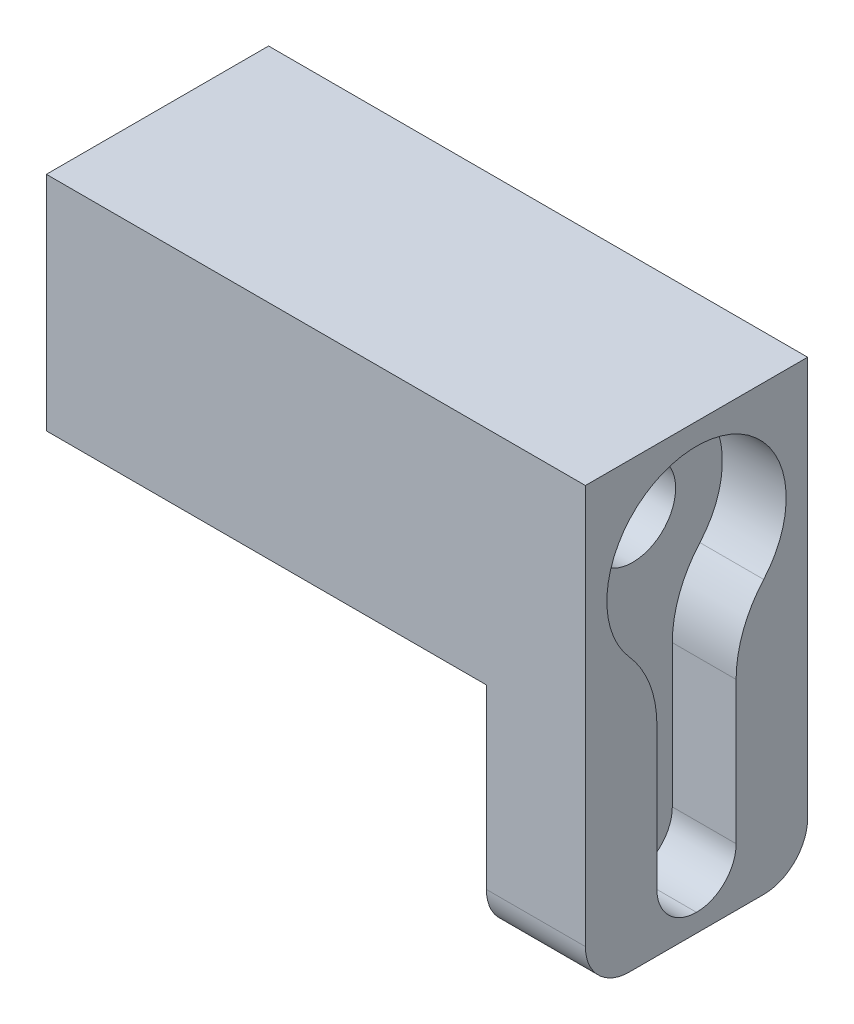
ISO-10303-21;
HEADER;
FILE_DESCRIPTION(('STEP AP214'),'2;1');
FILE_NAME('part.step','',(''),(''),'','','');
FILE_SCHEMA(('AUTOMOTIVE_DESIGN { 1 0 10303 214 1 1 1 1 }'));
ENDSEC;
DATA;
#1=APPLICATION_CONTEXT('core data for automotive mechanical design processes');
#2=APPLICATION_PROTOCOL_DEFINITION('international standard','automotive_design',2000,#1);
#3=PRODUCT_CONTEXT('',#1,'mechanical');
#4=PRODUCT('Part','Part','',(#3));
#5=PRODUCT_RELATED_PRODUCT_CATEGORY('part','',(#4));
#6=PRODUCT_DEFINITION_FORMATION('','',#4);
#7=PRODUCT_DEFINITION_CONTEXT('part definition',#1,'design');
#8=PRODUCT_DEFINITION('design','',#6,#7);
#9=PRODUCT_DEFINITION_SHAPE('','',#8);
#10=(LENGTH_UNIT() NAMED_UNIT(*) SI_UNIT(.MILLI.,.METRE.));
#11=(NAMED_UNIT(*) PLANE_ANGLE_UNIT() SI_UNIT($,.RADIAN.));
#12=(NAMED_UNIT(*) SI_UNIT($,.STERADIAN.) SOLID_ANGLE_UNIT());
#13=UNCERTAINTY_MEASURE_WITH_UNIT(LENGTH_MEASURE(1.E-05),#10,'distance_accuracy_value','');
#14=(GEOMETRIC_REPRESENTATION_CONTEXT(3) GLOBAL_UNCERTAINTY_ASSIGNED_CONTEXT((#13)) GLOBAL_UNIT_ASSIGNED_CONTEXT((#10,
#11,#12)) REPRESENTATION_CONTEXT('',''));
#15=CARTESIAN_POINT('',(0.,0.,0.));
#16=DIRECTION('',(0.,0.,1.));
#17=DIRECTION('',(1.,0.,0.));
#18=AXIS2_PLACEMENT_3D('',#15,#16,#17);
#19=CARTESIAN_POINT('',(29.,0.,0.));
#20=DIRECTION('',(-1.,0.,0.));
#21=DIRECTION('',(0.,0.,1.));
#22=AXIS2_PLACEMENT_3D('',#19,#20,#21);
#23=CYLINDRICAL_SURFACE('',#22,3.9);
#24=CARTESIAN_POINT('',(23.2,0.,0.));
#25=DIRECTION('',(1.,0.,0.));
#26=DIRECTION('',(0.,0.,-1.));
#27=AXIS2_PLACEMENT_3D('',#24,#25,#26);
#28=CIRCLE('',#27,3.9);
#29=CARTESIAN_POINT('',(23.2,0.,-3.9));
#30=VERTEX_POINT('',#29);
#31=EDGE_CURVE('E204',#30,#30,#28,.T.);
#32=ORIENTED_EDGE('',*,*,#31,.T.);
#33=EDGE_LOOP('',(#32));
#34=FACE_BOUND('',#33,.T.);
#35=CARTESIAN_POINT('',(19.,0.,0.));
#36=DIRECTION('',(-1.,0.,0.));
#37=DIRECTION('',(0.,0.,1.));
#38=AXIS2_PLACEMENT_3D('',#35,#36,#37);
#39=CIRCLE('',#38,3.9);
#40=CARTESIAN_POINT('',(19.,0.,3.9));
#41=VERTEX_POINT('',#40);
#42=EDGE_CURVE('E256',#41,#41,#39,.F.);
#43=ORIENTED_EDGE('',*,*,#42,.F.);
#44=EDGE_LOOP('',(#43));
#45=FACE_BOUND('',#44,.T.);
#46=ADVANCED_FACE('F36',(#34,#45),#23,.F.);
#47=CARTESIAN_POINT('',(20.,0.,0.));
#48=DIRECTION('',(1.,0.,0.));
#49=DIRECTION('',(0.,0.,-1.));
#50=AXIS2_PLACEMENT_3D('',#47,#48,#49);
#51=PLANE('',#50);
#52=CARTESIAN_POINT('',(20.,-20.6,0.));
#53=DIRECTION('',(1.,0.,0.));
#54=DIRECTION('',(0.,0.,-1.));
#55=AXIS2_PLACEMENT_3D('',#52,#53,#54);
#56=CIRCLE('',#55,1.75);
#57=CARTESIAN_POINT('',(20.,-20.6,-1.75));
#58=VERTEX_POINT('',#57);
#59=EDGE_CURVE('E201',#58,#58,#56,.F.);
#60=ORIENTED_EDGE('',*,*,#59,.F.);
#61=EDGE_LOOP('',(#60));
#62=FACE_BOUND('',#61,.T.);
#63=DIRECTION('',(0.,1.,0.));
#64=VECTOR('',#63,1.);
#65=CARTESIAN_POINT('',(20.,-30.2,-10.1));
#66=LINE('',#65,#64);
#67=CARTESIAN_POINT('',(20.,-26.2,-10.1));
#68=VERTEX_POINT('',#67);
#69=CARTESIAN_POINT('',(20.,-10.1,-10.1));
#70=VERTEX_POINT('',#69);
#71=EDGE_CURVE('E168',#68,#70,#66,.T.);
#72=ORIENTED_EDGE('',*,*,#71,.F.);
#73=CARTESIAN_POINT('',(20.,-26.2,-6.1));
#74=DIRECTION('',(1.,0.,0.));
#75=DIRECTION('',(0.,0.,-1.));
#76=AXIS2_PLACEMENT_3D('',#73,#74,#75);
#77=CIRCLE('',#76,4.);
#78=CARTESIAN_POINT('',(20.,-30.2,-6.09999999999999));
#79=VERTEX_POINT('',#78);
#80=EDGE_CURVE('E268',#68,#79,#77,.F.);
#81=ORIENTED_EDGE('',*,*,#80,.T.);
#82=DIRECTION('',(0.,0.,-1.));
#83=VECTOR('',#82,1.);
#84=CARTESIAN_POINT('',(20.,-30.2,22.5));
#85=LINE('',#84,#83);
#86=CARTESIAN_POINT('',(20.,-30.2,6.10000000000001));
#87=VERTEX_POINT('',#86);
#88=EDGE_CURVE('E195',#87,#79,#85,.T.);
#89=ORIENTED_EDGE('',*,*,#88,.F.);
#90=CARTESIAN_POINT('',(20.,-26.2,6.1));
#91=DIRECTION('',(1.,0.,0.));
#92=DIRECTION('',(0.,0.,-1.));
#93=AXIS2_PLACEMENT_3D('',#90,#91,#92);
#94=CIRCLE('',#93,4.);
#95=CARTESIAN_POINT('',(20.,-26.2,10.1));
#96=VERTEX_POINT('',#95);
#97=EDGE_CURVE('E266',#87,#96,#94,.F.);
#98=ORIENTED_EDGE('',*,*,#97,.T.);
#99=DIRECTION('',(0.,-1.,0.));
#100=VECTOR('',#99,1.);
#101=CARTESIAN_POINT('',(20.,10.1,10.1));
#102=LINE('',#101,#100);
#103=CARTESIAN_POINT('',(20.,-10.1,10.1));
#104=VERTEX_POINT('',#103);
#105=EDGE_CURVE('E163',#104,#96,#102,.T.);
#106=ORIENTED_EDGE('',*,*,#105,.F.);
#107=DIRECTION('',(0.,0.,1.));
#108=VECTOR('',#107,1.);
#109=CARTESIAN_POINT('',(20.,-10.1,-10.1));
#110=LINE('',#109,#108);
#111=EDGE_CURVE('E162',#70,#104,#110,.T.);
#112=ORIENTED_EDGE('',*,*,#111,.F.);
#113=EDGE_LOOP('',(#72,#81,#89,#98,#106,#112));
#114=FACE_BOUND('',#113,.T.);
#115=ADVANCED_FACE('F283',(#62,#114),#51,.F.);
#116=CARTESIAN_POINT('',(29.,0.,0.));
#117=DIRECTION('',(1.,0.,0.));
#118=DIRECTION('',(0.,0.,-1.));
#119=AXIS2_PLACEMENT_3D('',#116,#117,#118);
#120=PLANE('',#119);
#121=DIRECTION('',(0.,0.,1.));
#122=VECTOR('',#121,1.);
#123=CARTESIAN_POINT('',(29.,-30.2,22.5));
#124=LINE('',#123,#122);
#125=CARTESIAN_POINT('',(29.,-30.2,-6.09999999999999));
#126=VERTEX_POINT('',#125);
#127=CARTESIAN_POINT('',(29.,-30.2,6.10000000000001));
#128=VERTEX_POINT('',#127);
#129=EDGE_CURVE('E180',#126,#128,#124,.T.);
#130=ORIENTED_EDGE('',*,*,#129,.F.);
#131=CARTESIAN_POINT('',(29.,-26.2,-6.1));
#132=DIRECTION('',(1.,0.,0.));
#133=DIRECTION('',(0.,0.,-1.));
#134=AXIS2_PLACEMENT_3D('',#131,#132,#133);
#135=CIRCLE('',#134,4.);
#136=CARTESIAN_POINT('',(29.,-26.2,-10.1));
#137=VERTEX_POINT('',#136);
#138=EDGE_CURVE('E44',#126,#137,#135,.T.);
#139=ORIENTED_EDGE('',*,*,#138,.T.);
#140=DIRECTION('',(0.,-1.,0.));
#141=VECTOR('',#140,1.);
#142=CARTESIAN_POINT('',(29.,-30.2,-10.1));
#143=LINE('',#142,#141);
#144=CARTESIAN_POINT('',(29.,10.1,-10.1));
#145=VERTEX_POINT('',#144);
#146=EDGE_CURVE('E148',#145,#137,#143,.T.);
#147=ORIENTED_EDGE('',*,*,#146,.F.);
#148=DIRECTION('',(0.,0.,-1.));
#149=VECTOR('',#148,1.);
#150=CARTESIAN_POINT('',(29.,10.1,-10.));
#151=LINE('',#150,#149);
#152=CARTESIAN_POINT('',(29.,10.1,10.1));
#153=VERTEX_POINT('',#152);
#154=EDGE_CURVE('E160',#153,#145,#151,.T.);
#155=ORIENTED_EDGE('',*,*,#154,.F.);
#156=DIRECTION('',(0.,1.,0.));
#157=VECTOR('',#156,1.);
#158=CARTESIAN_POINT('',(29.,10.1,10.1));
#159=LINE('',#158,#157);
#160=CARTESIAN_POINT('',(29.,-26.2,10.1));
#161=VERTEX_POINT('',#160);
#162=EDGE_CURVE('E171',#161,#153,#159,.T.);
#163=ORIENTED_EDGE('',*,*,#162,.F.);
#164=CARTESIAN_POINT('',(29.,-26.2,6.1));
#165=DIRECTION('',(1.,0.,0.));
#166=DIRECTION('',(0.,0.,-1.));
#167=AXIS2_PLACEMENT_3D('',#164,#165,#166);
#168=CIRCLE('',#167,4.);
#169=EDGE_CURVE('E51',#161,#128,#168,.T.);
#170=ORIENTED_EDGE('',*,*,#169,.T.);
#171=EDGE_LOOP('',(#130,#139,#147,#155,#163,#170));
#172=FACE_BOUND('',#171,.T.);
#173=DIRECTION('',(0.,-1.,0.));
#174=VECTOR('',#173,1.);
#175=CARTESIAN_POINT('',(29.,-28.55,3.60000000000001));
#176=LINE('',#175,#174);
#177=CARTESIAN_POINT('',(29.,-12.0192553845902,3.6));
#178=VERTEX_POINT('',#177);
#179=CARTESIAN_POINT('',(29.,-24.95,3.60000000000001));
#180=VERTEX_POINT('',#179);
#181=EDGE_CURVE('E215',#178,#180,#176,.T.);
#182=ORIENTED_EDGE('',*,*,#181,.F.);
#183=CARTESIAN_POINT('',(29.,-12.0192553845902,13.6));
#184=DIRECTION('',(1.,0.,0.));
#185=DIRECTION('',(0.,0.,-1.));
#186=AXIS2_PLACEMENT_3D('',#183,#184,#185);
#187=CIRCLE('',#186,10.);
#188=CARTESIAN_POINT('',(29.,-5.39707610933388,6.1068870523416));
#189=VERTEX_POINT('',#188);
#190=EDGE_CURVE('E243',#178,#189,#187,.T.);
#191=ORIENTED_EDGE('',*,*,#190,.T.);
#192=CARTESIAN_POINT('',(29.,0.,0.));
#193=DIRECTION('',(1.,0.,0.));
#194=DIRECTION('',(0.,0.,-1.));
#195=AXIS2_PLACEMENT_3D('',#192,#193,#194);
#196=CIRCLE('',#195,8.15);
#197=CARTESIAN_POINT('',(29.,-5.39707610933388,-6.1068870523416));
#198=VERTEX_POINT('',#197);
#199=EDGE_CURVE('E208',#198,#189,#196,.T.);
#200=ORIENTED_EDGE('',*,*,#199,.F.);
#201=CARTESIAN_POINT('',(29.,-12.0192553845902,-13.6));
#202=DIRECTION('',(1.,0.,0.));
#203=DIRECTION('',(0.,0.,-1.));
#204=AXIS2_PLACEMENT_3D('',#201,#202,#203);
#205=CIRCLE('',#204,10.);
#206=CARTESIAN_POINT('',(29.,-12.0192553845902,-3.6));
#207=VERTEX_POINT('',#206);
#208=EDGE_CURVE('E241',#198,#207,#205,.T.);
#209=ORIENTED_EDGE('',*,*,#208,.T.);
#210=DIRECTION('',(0.,1.,0.));
#211=VECTOR('',#210,1.);
#212=CARTESIAN_POINT('',(29.,-28.55,-3.59999999999999));
#213=LINE('',#212,#211);
#214=CARTESIAN_POINT('',(29.,-24.95,-3.59999999999999));
#215=VERTEX_POINT('',#214);
#216=EDGE_CURVE('E217',#215,#207,#213,.T.);
#217=ORIENTED_EDGE('',*,*,#216,.F.);
#218=CARTESIAN_POINT('',(29.,-24.95,0.));
#219=DIRECTION('',(1.,0.,0.));
#220=DIRECTION('',(0.,0.,-1.));
#221=AXIS2_PLACEMENT_3D('',#218,#219,#220);
#222=CIRCLE('',#221,3.6);
#223=CARTESIAN_POINT('',(29.,-28.55,0.));
#224=VERTEX_POINT('',#223);
#225=EDGE_CURVE('E234',#215,#224,#222,.F.);
#226=ORIENTED_EDGE('',*,*,#225,.T.);
#227=CARTESIAN_POINT('',(29.,-24.95,0.));
#228=DIRECTION('',(1.,0.,0.));
#229=DIRECTION('',(0.,0.,-1.));
#230=AXIS2_PLACEMENT_3D('',#227,#228,#229);
#231=CIRCLE('',#230,3.6);
#232=EDGE_CURVE('E231',#224,#180,#231,.F.);
#233=ORIENTED_EDGE('',*,*,#232,.T.);
#234=EDGE_LOOP('',(#182,#191,#200,#209,#217,#226,#233));
#235=FACE_BOUND('',#234,.T.);
#236=ADVANCED_FACE('F165',(#172,#235),#120,.T.);
#237=CARTESIAN_POINT('',(23.2,-28.55,3.60000000000001));
#238=DIRECTION('',(0.,0.,1.));
#239=DIRECTION('',(0.,-1.,0.));
#240=AXIS2_PLACEMENT_3D('',#237,#238,#239);
#241=PLANE('',#240);
#242=DIRECTION('',(0.,-1.,0.));
#243=VECTOR('',#242,1.);
#244=CARTESIAN_POINT('',(23.2,-28.55,3.60000000000001));
#245=LINE('',#244,#243);
#246=CARTESIAN_POINT('',(23.2,-12.0192553845902,3.6));
#247=VERTEX_POINT('',#246);
#248=CARTESIAN_POINT('',(23.2,-24.95,3.60000000000001));
#249=VERTEX_POINT('',#248);
#250=EDGE_CURVE('E205',#247,#249,#245,.T.);
#251=ORIENTED_EDGE('',*,*,#250,.F.);
#252=DIRECTION('',(1.,0.,0.));
#253=VECTOR('',#252,1.);
#254=CARTESIAN_POINT('',(23.2,-12.0192553845902,3.6));
#255=LINE('',#254,#253);
#256=EDGE_CURVE('E236',#247,#178,#255,.T.);
#257=ORIENTED_EDGE('',*,*,#256,.T.);
#258=ORIENTED_EDGE('',*,*,#181,.T.);
#259=DIRECTION('',(1.,0.,0.));
#260=VECTOR('',#259,1.);
#261=CARTESIAN_POINT('',(23.2,-24.95,3.60000000000001));
#262=LINE('',#261,#260);
#263=EDGE_CURVE('E214',#180,#249,#262,.F.);
#264=ORIENTED_EDGE('',*,*,#263,.T.);
#265=EDGE_LOOP('',(#251,#257,#258,#264));
#266=FACE_BOUND('',#265,.T.);
#267=ADVANCED_FACE('F323',(#266),#241,.F.);
#268=CARTESIAN_POINT('',(23.2,0.,0.));
#269=DIRECTION('',(1.,0.,0.));
#270=DIRECTION('',(0.,0.,-1.));
#271=AXIS2_PLACEMENT_3D('',#268,#269,#270);
#272=CYLINDRICAL_SURFACE('',#271,8.15);
#273=ORIENTED_EDGE('',*,*,#199,.T.);
#274=DIRECTION('',(1.,0.,0.));
#275=VECTOR('',#274,1.);
#276=CARTESIAN_POINT('',(23.2,-5.39707610933388,6.1068870523416));
#277=LINE('',#276,#275);
#278=CARTESIAN_POINT('',(23.2,-5.39707610933388,6.1068870523416));
#279=VERTEX_POINT('',#278);
#280=EDGE_CURVE('E248',#189,#279,#277,.F.);
#281=ORIENTED_EDGE('',*,*,#280,.T.);
#282=CARTESIAN_POINT('',(23.2,0.,0.));
#283=DIRECTION('',(1.,0.,0.));
#284=DIRECTION('',(0.,0.,-1.));
#285=AXIS2_PLACEMENT_3D('',#282,#283,#284);
#286=CIRCLE('',#285,8.15);
#287=CARTESIAN_POINT('',(23.2,-5.39707610933388,-6.1068870523416));
#288=VERTEX_POINT('',#287);
#289=EDGE_CURVE('E211',#288,#279,#286,.T.);
#290=ORIENTED_EDGE('',*,*,#289,.F.);
#291=DIRECTION('',(1.,0.,0.));
#292=VECTOR('',#291,1.);
#293=CARTESIAN_POINT('',(23.2,-5.39707610933388,-6.1068870523416));
#294=LINE('',#293,#292);
#295=EDGE_CURVE('E245',#288,#198,#294,.T.);
#296=ORIENTED_EDGE('',*,*,#295,.T.);
#297=EDGE_LOOP('',(#273,#281,#290,#296));
#298=FACE_BOUND('',#297,.T.);
#299=ADVANCED_FACE('F320',(#298),#272,.F.);
#300=CARTESIAN_POINT('',(23.2,-28.55,-3.59999999999999));
#301=DIRECTION('',(0.,0.,-1.));
#302=DIRECTION('',(0.,1.,0.));
#303=AXIS2_PLACEMENT_3D('',#300,#301,#302);
#304=PLANE('',#303);
#305=ORIENTED_EDGE('',*,*,#216,.T.);
#306=DIRECTION('',(1.,0.,0.));
#307=VECTOR('',#306,1.);
#308=CARTESIAN_POINT('',(23.2,-12.0192553845902,-3.6));
#309=LINE('',#308,#307);
#310=CARTESIAN_POINT('',(23.2,-12.0192553845902,-3.6));
#311=VERTEX_POINT('',#310);
#312=EDGE_CURVE('E250',#207,#311,#309,.F.);
#313=ORIENTED_EDGE('',*,*,#312,.T.);
#314=DIRECTION('',(0.,1.,0.));
#315=VECTOR('',#314,1.);
#316=CARTESIAN_POINT('',(23.2,-28.55,-3.59999999999999));
#317=LINE('',#316,#315);
#318=CARTESIAN_POINT('',(23.2,-24.95,-3.59999999999999));
#319=VERTEX_POINT('',#318);
#320=EDGE_CURVE('E207',#319,#311,#317,.T.);
#321=ORIENTED_EDGE('',*,*,#320,.F.);
#322=DIRECTION('',(1.,0.,0.));
#323=VECTOR('',#322,1.);
#324=CARTESIAN_POINT('',(29.,-24.95,-3.59999999999999));
#325=LINE('',#324,#323);
#326=EDGE_CURVE('E229',#319,#215,#325,.T.);
#327=ORIENTED_EDGE('',*,*,#326,.T.);
#328=EDGE_LOOP('',(#305,#313,#321,#327));
#329=FACE_BOUND('',#328,.T.);
#330=ADVANCED_FACE('F318',(#329),#304,.F.);
#331=CARTESIAN_POINT('',(23.2,0.,0.));
#332=DIRECTION('',(1.,0.,0.));
#333=DIRECTION('',(0.,0.,-1.));
#334=AXIS2_PLACEMENT_3D('',#331,#332,#333);
#335=PLANE('',#334);
#336=CARTESIAN_POINT('',(23.2,-20.6,0.));
#337=DIRECTION('',(1.,0.,0.));
#338=DIRECTION('',(0.,0.,-1.));
#339=AXIS2_PLACEMENT_3D('',#336,#337,#338);
#340=CIRCLE('',#339,1.75);
#341=CARTESIAN_POINT('',(23.2,-20.6,-1.75));
#342=VERTEX_POINT('',#341);
#343=EDGE_CURVE('E198',#342,#342,#340,.T.);
#344=ORIENTED_EDGE('',*,*,#343,.F.);
#345=EDGE_LOOP('',(#344));
#346=FACE_BOUND('',#345,.T.);
#347=ORIENTED_EDGE('',*,*,#31,.F.);
#348=EDGE_LOOP('',(#347));
#349=FACE_BOUND('',#348,.T.);
#350=ORIENTED_EDGE('',*,*,#289,.T.);
#351=CARTESIAN_POINT('',(23.2,-12.0192553845902,13.6));
#352=DIRECTION('',(1.,0.,0.));
#353=DIRECTION('',(0.,0.,-1.));
#354=AXIS2_PLACEMENT_3D('',#351,#352,#353);
#355=CIRCLE('',#354,10.);
#356=EDGE_CURVE('E252',#279,#247,#355,.F.);
#357=ORIENTED_EDGE('',*,*,#356,.T.);
#358=ORIENTED_EDGE('',*,*,#250,.T.);
#359=CARTESIAN_POINT('',(23.2,-24.95,0.));
#360=DIRECTION('',(1.,0.,0.));
#361=DIRECTION('',(0.,0.,-1.));
#362=AXIS2_PLACEMENT_3D('',#359,#360,#361);
#363=CIRCLE('',#362,3.6);
#364=CARTESIAN_POINT('',(23.2,-28.55,0.));
#365=VERTEX_POINT('',#364);
#366=EDGE_CURVE('E227',#249,#365,#363,.T.);
#367=ORIENTED_EDGE('',*,*,#366,.T.);
#368=CARTESIAN_POINT('',(23.2,-24.95,0.));
#369=DIRECTION('',(1.,0.,0.));
#370=DIRECTION('',(0.,0.,-1.));
#371=AXIS2_PLACEMENT_3D('',#368,#369,#370);
#372=CIRCLE('',#371,3.6);
#373=EDGE_CURVE('E225',#365,#319,#372,.T.);
#374=ORIENTED_EDGE('',*,*,#373,.T.);
#375=ORIENTED_EDGE('',*,*,#320,.T.);
#376=CARTESIAN_POINT('',(23.2,-12.0192553845902,-13.6));
#377=DIRECTION('',(1.,0.,0.));
#378=DIRECTION('',(0.,0.,-1.));
#379=AXIS2_PLACEMENT_3D('',#376,#377,#378);
#380=CIRCLE('',#379,10.);
#381=EDGE_CURVE('E254',#311,#288,#380,.F.);
#382=ORIENTED_EDGE('',*,*,#381,.T.);
#383=EDGE_LOOP('',(#350,#357,#358,#367,#374,#375,#382));
#384=FACE_BOUND('',#383,.T.);
#385=ADVANCED_FACE('F314',(#346,#349,#384),#335,.T.);
#386=CARTESIAN_POINT('',(23.2,-24.95,0.));
#387=DIRECTION('',(-1.,0.,0.));
#388=DIRECTION('',(0.,0.,1.));
#389=AXIS2_PLACEMENT_3D('',#386,#387,#388);
#390=CYLINDRICAL_SURFACE('',#389,3.6);
#391=ORIENTED_EDGE('',*,*,#326,.F.);
#392=ORIENTED_EDGE('',*,*,#373,.F.);
#393=DIRECTION('',(1.,0.,0.));
#394=VECTOR('',#393,1.);
#395=CARTESIAN_POINT('',(23.2,-28.55,0.));
#396=LINE('',#395,#394);
#397=EDGE_CURVE('E218',#224,#365,#396,.F.);
#398=ORIENTED_EDGE('',*,*,#397,.F.);
#399=ORIENTED_EDGE('',*,*,#225,.F.);
#400=EDGE_LOOP('',(#391,#392,#398,#399));
#401=FACE_BOUND('',#400,.T.);
#402=ADVANCED_FACE('F317',(#401),#390,.F.);
#403=CARTESIAN_POINT('',(23.2,-24.95,0.));
#404=DIRECTION('',(-1.,0.,0.));
#405=DIRECTION('',(0.,0.,1.));
#406=AXIS2_PLACEMENT_3D('',#403,#404,#405);
#407=CYLINDRICAL_SURFACE('',#406,3.6);
#408=ORIENTED_EDGE('',*,*,#366,.F.);
#409=ORIENTED_EDGE('',*,*,#263,.F.);
#410=ORIENTED_EDGE('',*,*,#232,.F.);
#411=ORIENTED_EDGE('',*,*,#397,.T.);
#412=EDGE_LOOP('',(#408,#409,#410,#411));
#413=FACE_BOUND('',#412,.T.);
#414=ADVANCED_FACE('F333',(#413),#407,.F.);
#415=CARTESIAN_POINT('',(23.2,-12.0192553845902,13.6));
#416=DIRECTION('',(1.,0.,0.));
#417=DIRECTION('',(0.,0.,-1.));
#418=AXIS2_PLACEMENT_3D('',#415,#416,#417);
#419=CYLINDRICAL_SURFACE('',#418,10.);
#420=ORIENTED_EDGE('',*,*,#356,.F.);
#421=ORIENTED_EDGE('',*,*,#280,.F.);
#422=ORIENTED_EDGE('',*,*,#190,.F.);
#423=ORIENTED_EDGE('',*,*,#256,.F.);
#424=EDGE_LOOP('',(#420,#421,#422,#423));
#425=FACE_BOUND('',#424,.T.);
#426=ADVANCED_FACE('F336',(#425),#419,.T.);
#427=CARTESIAN_POINT('',(23.2,-12.0192553845902,-13.6));
#428=DIRECTION('',(1.,0.,0.));
#429=DIRECTION('',(0.,0.,-1.));
#430=AXIS2_PLACEMENT_3D('',#427,#428,#429);
#431=CYLINDRICAL_SURFACE('',#430,10.);
#432=ORIENTED_EDGE('',*,*,#381,.F.);
#433=ORIENTED_EDGE('',*,*,#312,.F.);
#434=ORIENTED_EDGE('',*,*,#208,.F.);
#435=ORIENTED_EDGE('',*,*,#295,.F.);
#436=EDGE_LOOP('',(#432,#433,#434,#435));
#437=FACE_BOUND('',#436,.T.);
#438=ADVANCED_FACE('F343',(#437),#431,.T.);
#439=CARTESIAN_POINT('',(-0.001000000000001,-20.6,0.));
#440=DIRECTION('',(1.,0.,0.));
#441=DIRECTION('',(0.,0.,-1.));
#442=AXIS2_PLACEMENT_3D('',#439,#440,#441);
#443=CYLINDRICAL_SURFACE('',#442,1.75);
#444=ORIENTED_EDGE('',*,*,#343,.T.);
#445=EDGE_LOOP('',(#444));
#446=FACE_BOUND('',#445,.T.);
#447=ORIENTED_EDGE('',*,*,#59,.T.);
#448=EDGE_LOOP('',(#447));
#449=FACE_BOUND('',#448,.T.);
#450=ADVANCED_FACE('F312',(#446,#449),#443,.F.);
#451=CARTESIAN_POINT('',(0.,-30.2,0.));
#452=DIRECTION('',(0.,1.,0.));
#453=DIRECTION('',(0.,0.,1.));
#454=AXIS2_PLACEMENT_3D('',#451,#452,#453);
#455=PLANE('',#454);
#456=ORIENTED_EDGE('',*,*,#88,.T.);
#457=DIRECTION('',(-1.,0.,0.));
#458=VECTOR('',#457,1.);
#459=CARTESIAN_POINT('',(29.,-30.2,-6.1));
#460=LINE('',#459,#458);
#461=EDGE_CURVE('E272',#79,#126,#460,.F.);
#462=ORIENTED_EDGE('',*,*,#461,.T.);
#463=ORIENTED_EDGE('',*,*,#129,.T.);
#464=DIRECTION('',(1.,0.,0.));
#465=VECTOR('',#464,1.);
#466=CARTESIAN_POINT('',(20.,-30.2,6.1));
#467=LINE('',#466,#465);
#468=EDGE_CURVE('E270',#128,#87,#467,.F.);
#469=ORIENTED_EDGE('',*,*,#468,.T.);
#470=EDGE_LOOP('',(#456,#462,#463,#469));
#471=FACE_BOUND('',#470,.T.);
#472=ADVANCED_FACE('F276',(#471),#455,.F.);
#473=CARTESIAN_POINT('',(-20.,0.,0.));
#474=DIRECTION('',(1.,0.,0.));
#475=DIRECTION('',(0.,0.,-1.));
#476=AXIS2_PLACEMENT_3D('',#473,#474,#475);
#477=PLANE('',#476);
#478=CARTESIAN_POINT('',(-20.,0.,0.));
#479=DIRECTION('',(-1.,0.,0.));
#480=DIRECTION('',(0.,0.,1.));
#481=AXIS2_PLACEMENT_3D('',#478,#479,#480);
#482=CIRCLE('',#481,3.);
#483=CARTESIAN_POINT('',(-20.,0.,3.));
#484=VERTEX_POINT('',#483);
#485=EDGE_CURVE('E169',#484,#484,#482,.T.);
#486=ORIENTED_EDGE('',*,*,#485,.F.);
#487=EDGE_LOOP('',(#486));
#488=FACE_BOUND('',#487,.T.);
#489=DIRECTION('',(0.,0.,1.));
#490=VECTOR('',#489,1.);
#491=CARTESIAN_POINT('',(-20.,-10.1,-10.1));
#492=LINE('',#491,#490);
#493=CARTESIAN_POINT('',(-20.,-10.1,-10.1));
#494=VERTEX_POINT('',#493);
#495=CARTESIAN_POINT('',(-20.,-10.1,10.1));
#496=VERTEX_POINT('',#495);
#497=EDGE_CURVE('E186',#494,#496,#492,.T.);
#498=ORIENTED_EDGE('',*,*,#497,.T.);
#499=DIRECTION('',(0.,1.,0.));
#500=VECTOR('',#499,1.);
#501=CARTESIAN_POINT('',(-20.,-10.1,10.1));
#502=LINE('',#501,#500);
#503=CARTESIAN_POINT('',(-20.,10.1,10.1));
#504=VERTEX_POINT('',#503);
#505=EDGE_CURVE('E183',#496,#504,#502,.T.);
#506=ORIENTED_EDGE('',*,*,#505,.T.);
#507=DIRECTION('',(0.,0.,-1.));
#508=VECTOR('',#507,1.);
#509=CARTESIAN_POINT('',(-20.,10.1,10.1));
#510=LINE('',#509,#508);
#511=CARTESIAN_POINT('',(-20.,10.1,-10.1));
#512=VERTEX_POINT('',#511);
#513=EDGE_CURVE('E181',#504,#512,#510,.T.);
#514=ORIENTED_EDGE('',*,*,#513,.T.);
#515=DIRECTION('',(0.,-1.,0.));
#516=VECTOR('',#515,1.);
#517=CARTESIAN_POINT('',(-20.,10.1,-10.1));
#518=LINE('',#517,#516);
#519=EDGE_CURVE('E151',#512,#494,#518,.T.);
#520=ORIENTED_EDGE('',*,*,#519,.T.);
#521=EDGE_LOOP('',(#498,#506,#514,#520));
#522=FACE_BOUND('',#521,.T.);
#523=ADVANCED_FACE('F292',(#488,#522),#477,.F.);
#524=CARTESIAN_POINT('',(48.5671139599365,-10.1,-10.1));
#525=DIRECTION('',(0.,-1.,0.));
#526=DIRECTION('',(0.,0.,-1.));
#527=AXIS2_PLACEMENT_3D('',#524,#525,#526);
#528=PLANE('',#527);
#529=DIRECTION('',(-1.,0.,0.));
#530=VECTOR('',#529,1.);
#531=CARTESIAN_POINT('',(48.5671139599365,-10.1,-10.1));
#532=LINE('',#531,#530);
#533=EDGE_CURVE('E156',#70,#494,#532,.T.);
#534=ORIENTED_EDGE('',*,*,#533,.F.);
#535=ORIENTED_EDGE('',*,*,#111,.T.);
#536=DIRECTION('',(-1.,0.,0.));
#537=VECTOR('',#536,1.);
#538=CARTESIAN_POINT('',(48.5671139599365,-10.1,10.1));
#539=LINE('',#538,#537);
#540=EDGE_CURVE('E190',#104,#496,#539,.T.);
#541=ORIENTED_EDGE('',*,*,#540,.T.);
#542=ORIENTED_EDGE('',*,*,#497,.F.);
#543=EDGE_LOOP('',(#534,#535,#541,#542));
#544=FACE_BOUND('',#543,.T.);
#545=ADVANCED_FACE('F289',(#544),#528,.T.);
#546=CARTESIAN_POINT('',(48.5671139599365,10.1,-10.1));
#547=DIRECTION('',(0.,0.,-1.));
#548=DIRECTION('',(-1.,0.,0.));
#549=AXIS2_PLACEMENT_3D('',#546,#547,#548);
#550=PLANE('',#549);
#551=ORIENTED_EDGE('',*,*,#146,.T.);
#552=DIRECTION('',(-1.,0.,0.));
#553=VECTOR('',#552,1.);
#554=CARTESIAN_POINT('',(20.,-26.2,-10.1));
#555=LINE('',#554,#553);
#556=EDGE_CURVE('E264',#137,#68,#555,.T.);
#557=ORIENTED_EDGE('',*,*,#556,.T.);
#558=ORIENTED_EDGE('',*,*,#71,.T.);
#559=ORIENTED_EDGE('',*,*,#533,.T.);
#560=ORIENTED_EDGE('',*,*,#519,.F.);
#561=DIRECTION('',(-1.,0.,0.));
#562=VECTOR('',#561,1.);
#563=CARTESIAN_POINT('',(48.5671139599365,10.1,-10.1));
#564=LINE('',#563,#562);
#565=EDGE_CURVE('E143',#145,#512,#564,.T.);
#566=ORIENTED_EDGE('',*,*,#565,.F.);
#567=EDGE_LOOP('',(#551,#557,#558,#559,#560,#566));
#568=FACE_BOUND('',#567,.T.);
#569=ADVANCED_FACE('F145',(#568),#550,.T.);
#570=CARTESIAN_POINT('',(48.5671139599365,10.1,10.1));
#571=DIRECTION('',(0.,1.,0.));
#572=DIRECTION('',(0.,0.,1.));
#573=AXIS2_PLACEMENT_3D('',#570,#571,#572);
#574=PLANE('',#573);
#575=ORIENTED_EDGE('',*,*,#154,.T.);
#576=ORIENTED_EDGE('',*,*,#565,.T.);
#577=ORIENTED_EDGE('',*,*,#513,.F.);
#578=DIRECTION('',(-1.,0.,0.));
#579=VECTOR('',#578,1.);
#580=CARTESIAN_POINT('',(48.5671139599365,10.1,10.1));
#581=LINE('',#580,#579);
#582=EDGE_CURVE('E155',#153,#504,#581,.T.);
#583=ORIENTED_EDGE('',*,*,#582,.F.);
#584=EDGE_LOOP('',(#575,#576,#577,#583));
#585=FACE_BOUND('',#584,.T.);
#586=ADVANCED_FACE('F161',(#585),#574,.T.);
#587=CARTESIAN_POINT('',(48.5671139599365,-10.1,10.1));
#588=DIRECTION('',(0.,0.,1.));
#589=DIRECTION('',(1.,0.,0.));
#590=AXIS2_PLACEMENT_3D('',#587,#588,#589);
#591=PLANE('',#590);
#592=ORIENTED_EDGE('',*,*,#105,.T.);
#593=DIRECTION('',(1.,0.,0.));
#594=VECTOR('',#593,1.);
#595=CARTESIAN_POINT('',(29.,-26.2,10.1));
#596=LINE('',#595,#594);
#597=EDGE_CURVE('E11',#96,#161,#596,.T.);
#598=ORIENTED_EDGE('',*,*,#597,.T.);
#599=ORIENTED_EDGE('',*,*,#162,.T.);
#600=ORIENTED_EDGE('',*,*,#582,.T.);
#601=ORIENTED_EDGE('',*,*,#505,.F.);
#602=ORIENTED_EDGE('',*,*,#540,.F.);
#603=EDGE_LOOP('',(#592,#598,#599,#600,#601,#602));
#604=FACE_BOUND('',#603,.T.);
#605=ADVANCED_FACE('F294',(#604),#591,.T.);
#606=CARTESIAN_POINT('',(19.,0.,0.));
#607=DIRECTION('',(-1.,0.,0.));
#608=DIRECTION('',(0.,0.,1.));
#609=AXIS2_PLACEMENT_3D('',#606,#607,#608);
#610=PLANE('',#609);
#611=ORIENTED_EDGE('',*,*,#42,.T.);
#612=EDGE_LOOP('',(#611));
#613=FACE_BOUND('',#612,.T.);
#614=ADVANCED_FACE('F354',(#613),#610,.F.);
#615=CARTESIAN_POINT('',(-18.,0.,0.));
#616=DIRECTION('',(-1.,0.,0.));
#617=DIRECTION('',(0.,0.,1.));
#618=AXIS2_PLACEMENT_3D('',#615,#616,#617);
#619=PLANE('',#618);
#620=CARTESIAN_POINT('',(-18.,0.,0.));
#621=DIRECTION('',(-1.,0.,0.));
#622=DIRECTION('',(0.,0.,1.));
#623=AXIS2_PLACEMENT_3D('',#620,#621,#622);
#624=CIRCLE('',#623,0.013363095386386);
#625=CARTESIAN_POINT('',(-18.,0.,0.013363095386386));
#626=VERTEX_POINT('',#625);
#627=EDGE_CURVE('E261',#626,#626,#624,.T.);
#628=ORIENTED_EDGE('',*,*,#627,.T.);
#629=EDGE_LOOP('',(#628));
#630=FACE_BOUND('',#629,.T.);
#631=ADVANCED_FACE('F349',(#630),#619,.T.);
#632=CARTESIAN_POINT('',(-21.23,0.,0.));
#633=DIRECTION('',(1.,0.,0.));
#634=DIRECTION('',(0.,0.,-1.));
#635=AXIS2_PLACEMENT_3D('',#632,#633,#634);
#636=DEGENERATE_TOROIDAL_SURFACE('',#635,0.013363095386386,3.23,.T.);
#637=ORIENTED_EDGE('',*,*,#485,.T.);
#638=EDGE_LOOP('',(#637));
#639=FACE_BOUND('',#638,.T.);
#640=ORIENTED_EDGE('',*,*,#627,.F.);
#641=EDGE_LOOP('',(#640));
#642=FACE_BOUND('',#641,.T.);
#643=ADVANCED_FACE('F300',(#639,#642),#636,.F.);
#644=CARTESIAN_POINT('',(48.5671139599365,-26.2,-6.1));
#645=DIRECTION('',(1.,0.,0.));
#646=DIRECTION('',(0.,0.,-1.));
#647=AXIS2_PLACEMENT_3D('',#644,#645,#646);
#648=CYLINDRICAL_SURFACE('',#647,4.);
#649=ORIENTED_EDGE('',*,*,#138,.F.);
#650=ORIENTED_EDGE('',*,*,#461,.F.);
#651=ORIENTED_EDGE('',*,*,#80,.F.);
#652=ORIENTED_EDGE('',*,*,#556,.F.);
#653=EDGE_LOOP('',(#649,#650,#651,#652));
#654=FACE_BOUND('',#653,.T.);
#655=ADVANCED_FACE('F279',(#654),#648,.T.);
#656=CARTESIAN_POINT('',(48.5671139599365,-26.2,6.1));
#657=DIRECTION('',(-1.,0.,0.));
#658=DIRECTION('',(0.,0.,1.));
#659=AXIS2_PLACEMENT_3D('',#656,#657,#658);
#660=CYLINDRICAL_SURFACE('',#659,4.);
#661=ORIENTED_EDGE('',*,*,#97,.F.);
#662=ORIENTED_EDGE('',*,*,#468,.F.);
#663=ORIENTED_EDGE('',*,*,#169,.F.);
#664=ORIENTED_EDGE('',*,*,#597,.F.);
#665=EDGE_LOOP('',(#661,#662,#663,#664));
#666=FACE_BOUND('',#665,.T.);
#667=ADVANCED_FACE('F38',(#666),#660,.T.);
#668=CLOSED_SHELL('',(#46,#115,#236,#267,#299,#330,#385,#402,#414,#426,#438,#450,#472,#523,#545,
#569,#586,#605,#614,#631,#643,#655,#667));
#669=MANIFOLD_SOLID_BREP('B2',#668);
#670=ADVANCED_BREP_SHAPE_REPRESENTATION('',(#18,#669),#14);
#671=SHAPE_DEFINITION_REPRESENTATION(#9,#670);
ENDSEC;
END-ISO-10303-21;
